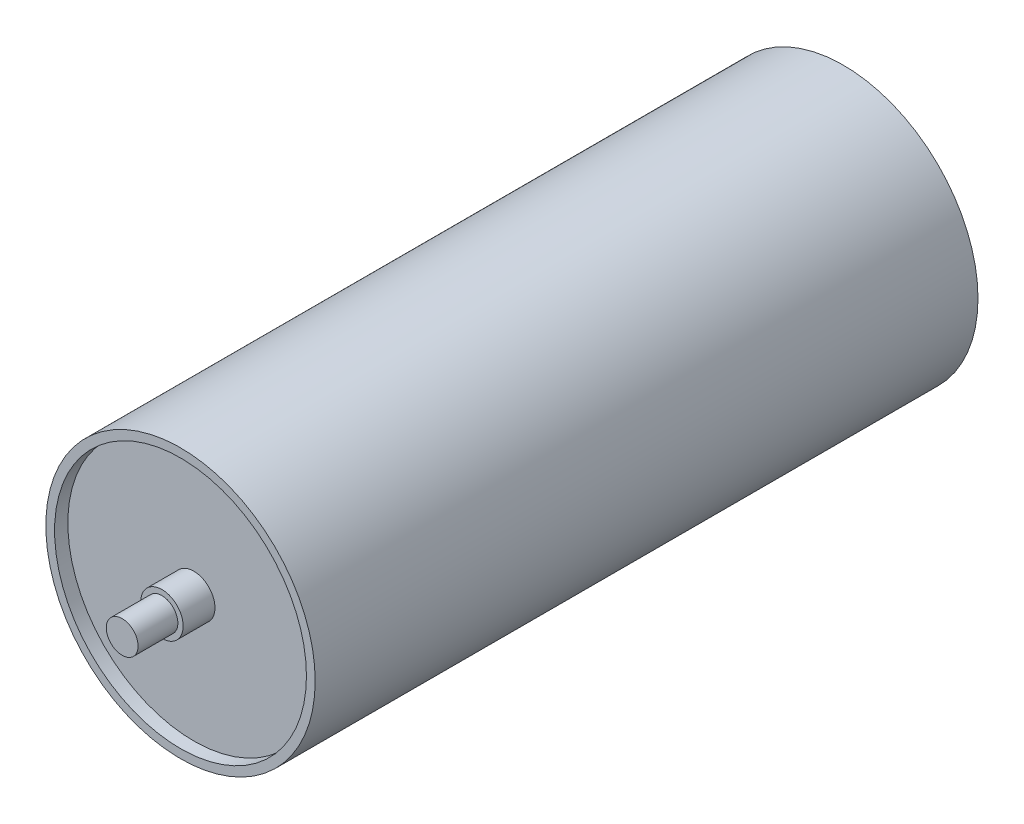
ISO-10303-21;
HEADER;
FILE_DESCRIPTION(('STEP AP214'),'2;1');
FILE_NAME('part.step','',(''),(''),'','','');
FILE_SCHEMA(('AUTOMOTIVE_DESIGN { 1 0 10303 214 1 1 1 1 }'));
ENDSEC;
DATA;
#1=APPLICATION_CONTEXT('core data for automotive mechanical design processes');
#2=APPLICATION_PROTOCOL_DEFINITION('international standard','automotive_design',2000,#1);
#3=PRODUCT_CONTEXT('',#1,'mechanical');
#4=PRODUCT('Part','Part','',(#3));
#5=PRODUCT_RELATED_PRODUCT_CATEGORY('part','',(#4));
#6=PRODUCT_DEFINITION_FORMATION('','',#4);
#7=PRODUCT_DEFINITION_CONTEXT('part definition',#1,'design');
#8=PRODUCT_DEFINITION('design','',#6,#7);
#9=PRODUCT_DEFINITION_SHAPE('','',#8);
#10=(LENGTH_UNIT() NAMED_UNIT(*) SI_UNIT(.MILLI.,.METRE.));
#11=(NAMED_UNIT(*) PLANE_ANGLE_UNIT() SI_UNIT($,.RADIAN.));
#12=(NAMED_UNIT(*) SI_UNIT($,.STERADIAN.) SOLID_ANGLE_UNIT());
#13=UNCERTAINTY_MEASURE_WITH_UNIT(LENGTH_MEASURE(1.E-05),#10,'distance_accuracy_value','');
#14=(GEOMETRIC_REPRESENTATION_CONTEXT(3) GLOBAL_UNCERTAINTY_ASSIGNED_CONTEXT((#13)) GLOBAL_UNIT_ASSIGNED_CONTEXT((#10,
#11,#12)) REPRESENTATION_CONTEXT('',''));
#15=CARTESIAN_POINT('',(0.,0.,0.));
#16=DIRECTION('',(0.,0.,1.));
#17=DIRECTION('',(1.,0.,0.));
#18=AXIS2_PLACEMENT_3D('',#15,#16,#17);
#19=CARTESIAN_POINT('',(0.,0.,250.));
#20=DIRECTION('',(0.,0.,-1.));
#21=DIRECTION('',(-1.,0.,0.));
#22=AXIS2_PLACEMENT_3D('',#19,#20,#21);
#23=CYLINDRICAL_SURFACE('',#22,50.8);
#24=CARTESIAN_POINT('',(0.,0.,250.));
#25=DIRECTION('',(0.,0.,1.));
#26=DIRECTION('',(1.,0.,0.));
#27=AXIS2_PLACEMENT_3D('',#24,#25,#26);
#28=CIRCLE('',#27,50.8);
#29=CARTESIAN_POINT('',(50.8,0.,250.));
#30=VERTEX_POINT('',#29);
#31=EDGE_CURVE('E50',#30,#30,#28,.T.);
#32=ORIENTED_EDGE('',*,*,#31,.F.);
#33=EDGE_LOOP('',(#32));
#34=FACE_BOUND('',#33,.T.);
#35=CARTESIAN_POINT('',(0.,0.,0.));
#36=DIRECTION('',(0.,0.,1.));
#37=DIRECTION('',(1.,0.,0.));
#38=AXIS2_PLACEMENT_3D('',#35,#36,#37);
#39=CIRCLE('',#38,50.8);
#40=CARTESIAN_POINT('',(50.8,0.,0.));
#41=VERTEX_POINT('',#40);
#42=EDGE_CURVE('E41',#41,#41,#39,.T.);
#43=ORIENTED_EDGE('',*,*,#42,.T.);
#44=EDGE_LOOP('',(#43));
#45=FACE_BOUND('',#44,.T.);
#46=ADVANCED_FACE('F38',(#34,#45),#23,.T.);
#47=CARTESIAN_POINT('',(0.,0.,250.));
#48=DIRECTION('',(0.,0.,1.));
#49=DIRECTION('',(1.,0.,0.));
#50=AXIS2_PLACEMENT_3D('',#47,#48,#49);
#51=PLANE('',#50);
#52=CARTESIAN_POINT('',(0.,0.,250.));
#53=DIRECTION('',(0.,0.,1.));
#54=DIRECTION('',(1.,0.,0.));
#55=AXIS2_PLACEMENT_3D('',#52,#53,#54);
#56=CIRCLE('',#55,47.5);
#57=CARTESIAN_POINT('',(47.5,0.,250.));
#58=VERTEX_POINT('',#57);
#59=EDGE_CURVE('E74',#58,#58,#56,.T.);
#60=ORIENTED_EDGE('',*,*,#59,.F.);
#61=EDGE_LOOP('',(#60));
#62=FACE_BOUND('',#61,.T.);
#63=ORIENTED_EDGE('',*,*,#31,.T.);
#64=EDGE_LOOP('',(#63));
#65=FACE_BOUND('',#64,.T.);
#66=ADVANCED_FACE('F91',(#62,#65),#51,.T.);
#67=CARTESIAN_POINT('',(0.,0.,0.));
#68=DIRECTION('',(0.,0.,1.));
#69=DIRECTION('',(1.,0.,0.));
#70=AXIS2_PLACEMENT_3D('',#67,#68,#69);
#71=PLANE('',#70);
#72=CARTESIAN_POINT('',(0.,0.,0.));
#73=DIRECTION('',(0.,0.,-1.));
#74=DIRECTION('',(-1.,0.,0.));
#75=AXIS2_PLACEMENT_3D('',#72,#73,#74);
#76=CIRCLE('',#75,47.5);
#77=CARTESIAN_POINT('',(-47.5,0.,0.));
#78=VERTEX_POINT('',#77);
#79=EDGE_CURVE('E68',#78,#78,#76,.T.);
#80=ORIENTED_EDGE('',*,*,#79,.F.);
#81=EDGE_LOOP('',(#80));
#82=FACE_BOUND('',#81,.T.);
#83=ORIENTED_EDGE('',*,*,#42,.F.);
#84=EDGE_LOOP('',(#83));
#85=FACE_BOUND('',#84,.T.);
#86=ADVANCED_FACE('F88',(#82,#85),#71,.F.);
#87=CARTESIAN_POINT('',(0.,0.,245.));
#88=DIRECTION('',(0.,0.,1.));
#89=DIRECTION('',(1.,0.,0.));
#90=AXIS2_PLACEMENT_3D('',#87,#88,#89);
#91=CYLINDRICAL_SURFACE('',#90,47.5);
#92=CARTESIAN_POINT('',(0.,0.,245.));
#93=DIRECTION('',(0.,0.,1.));
#94=DIRECTION('',(1.,0.,0.));
#95=AXIS2_PLACEMENT_3D('',#92,#93,#94);
#96=CIRCLE('',#95,47.5);
#97=CARTESIAN_POINT('',(47.5,0.,245.));
#98=VERTEX_POINT('',#97);
#99=EDGE_CURVE('E77',#98,#98,#96,.T.);
#100=ORIENTED_EDGE('',*,*,#99,.F.);
#101=EDGE_LOOP('',(#100));
#102=FACE_BOUND('',#101,.T.);
#103=ORIENTED_EDGE('',*,*,#59,.T.);
#104=EDGE_LOOP('',(#103));
#105=FACE_BOUND('',#104,.T.);
#106=ADVANCED_FACE('F90',(#102,#105),#91,.F.);
#107=CARTESIAN_POINT('',(0.,0.,245.));
#108=DIRECTION('',(0.,0.,1.));
#109=DIRECTION('',(1.,0.,0.));
#110=AXIS2_PLACEMENT_3D('',#107,#108,#109);
#111=PLANE('',#110);
#112=CARTESIAN_POINT('',(0.,0.,245.));
#113=DIRECTION('',(0.,0.,1.));
#114=DIRECTION('',(1.,0.,0.));
#115=AXIS2_PLACEMENT_3D('',#112,#113,#114);
#116=CIRCLE('',#115,8.);
#117=CARTESIAN_POINT('',(8.,0.,245.));
#118=VERTEX_POINT('',#117);
#119=EDGE_CURVE('E57',#118,#118,#116,.T.);
#120=ORIENTED_EDGE('',*,*,#119,.F.);
#121=EDGE_LOOP('',(#120));
#122=FACE_BOUND('',#121,.T.);
#123=ORIENTED_EDGE('',*,*,#99,.T.);
#124=EDGE_LOOP('',(#123));
#125=FACE_BOUND('',#124,.T.);
#126=ADVANCED_FACE('F97',(#122,#125),#111,.T.);
#127=CARTESIAN_POINT('',(0.,0.,5.));
#128=DIRECTION('',(0.,0.,-1.));
#129=DIRECTION('',(-1.,0.,0.));
#130=AXIS2_PLACEMENT_3D('',#127,#128,#129);
#131=CYLINDRICAL_SURFACE('',#130,47.5);
#132=CARTESIAN_POINT('',(0.,0.,5.));
#133=DIRECTION('',(0.,0.,-1.));
#134=DIRECTION('',(-1.,0.,0.));
#135=AXIS2_PLACEMENT_3D('',#132,#133,#134);
#136=CIRCLE('',#135,47.5);
#137=CARTESIAN_POINT('',(-47.5,0.,5.));
#138=VERTEX_POINT('',#137);
#139=EDGE_CURVE('E71',#138,#138,#136,.T.);
#140=ORIENTED_EDGE('',*,*,#139,.F.);
#141=EDGE_LOOP('',(#140));
#142=FACE_BOUND('',#141,.T.);
#143=ORIENTED_EDGE('',*,*,#79,.T.);
#144=EDGE_LOOP('',(#143));
#145=FACE_BOUND('',#144,.T.);
#146=ADVANCED_FACE('F131',(#142,#145),#131,.F.);
#147=CARTESIAN_POINT('',(0.,0.,5.));
#148=DIRECTION('',(0.,0.,-1.));
#149=DIRECTION('',(-1.,0.,0.));
#150=AXIS2_PLACEMENT_3D('',#147,#148,#149);
#151=PLANE('',#150);
#152=CARTESIAN_POINT('',(0.,0.,5.));
#153=DIRECTION('',(0.,0.,-1.));
#154=DIRECTION('',(-1.,0.,0.));
#155=AXIS2_PLACEMENT_3D('',#152,#153,#154);
#156=CIRCLE('',#155,8.);
#157=CARTESIAN_POINT('',(-8.,0.,5.));
#158=VERTEX_POINT('',#157);
#159=EDGE_CURVE('E62',#158,#158,#156,.T.);
#160=ORIENTED_EDGE('',*,*,#159,.F.);
#161=EDGE_LOOP('',(#160));
#162=FACE_BOUND('',#161,.T.);
#163=ORIENTED_EDGE('',*,*,#139,.T.);
#164=EDGE_LOOP('',(#163));
#165=FACE_BOUND('',#164,.T.);
#166=ADVANCED_FACE('F136',(#162,#165),#151,.T.);
#167=CARTESIAN_POINT('',(0.,0.,-6.));
#168=DIRECTION('',(0.,0.,1.));
#169=DIRECTION('',(1.,0.,0.));
#170=AXIS2_PLACEMENT_3D('',#167,#168,#169);
#171=CYLINDRICAL_SURFACE('',#170,8.);
#172=CARTESIAN_POINT('',(0.,0.,-6.));
#173=DIRECTION('',(0.,0.,-1.));
#174=DIRECTION('',(-1.,0.,0.));
#175=AXIS2_PLACEMENT_3D('',#172,#173,#174);
#176=CIRCLE('',#175,8.);
#177=CARTESIAN_POINT('',(-8.,0.,-6.));
#178=VERTEX_POINT('',#177);
#179=EDGE_CURVE('E65',#178,#178,#176,.T.);
#180=ORIENTED_EDGE('',*,*,#179,.F.);
#181=EDGE_LOOP('',(#180));
#182=FACE_BOUND('',#181,.T.);
#183=ORIENTED_EDGE('',*,*,#159,.T.);
#184=EDGE_LOOP('',(#183));
#185=FACE_BOUND('',#184,.T.);
#186=ADVANCED_FACE('F147',(#182,#185),#171,.T.);
#187=CARTESIAN_POINT('',(0.,0.,-6.));
#188=DIRECTION('',(0.,0.,-1.));
#189=DIRECTION('',(-1.,0.,0.));
#190=AXIS2_PLACEMENT_3D('',#187,#188,#189);
#191=PLANE('',#190);
#192=CARTESIAN_POINT('',(0.,0.,-6.));
#193=DIRECTION('',(0.,0.,-1.));
#194=DIRECTION('',(-1.,0.,0.));
#195=AXIS2_PLACEMENT_3D('',#192,#193,#194);
#196=CIRCLE('',#195,6.);
#197=CARTESIAN_POINT('',(-6.,0.,-6.));
#198=VERTEX_POINT('',#197);
#199=EDGE_CURVE('E45',#198,#198,#196,.T.);
#200=ORIENTED_EDGE('',*,*,#199,.F.);
#201=EDGE_LOOP('',(#200));
#202=FACE_BOUND('',#201,.T.);
#203=ORIENTED_EDGE('',*,*,#179,.T.);
#204=EDGE_LOOP('',(#203));
#205=FACE_BOUND('',#204,.T.);
#206=ADVANCED_FACE('F158',(#202,#205),#191,.T.);
#207=CARTESIAN_POINT('',(0.,0.,257.));
#208=DIRECTION('',(0.,0.,-1.));
#209=DIRECTION('',(-1.,0.,0.));
#210=AXIS2_PLACEMENT_3D('',#207,#208,#209);
#211=CYLINDRICAL_SURFACE('',#210,8.);
#212=CARTESIAN_POINT('',(0.,0.,257.));
#213=DIRECTION('',(0.,0.,1.));
#214=DIRECTION('',(1.,0.,0.));
#215=AXIS2_PLACEMENT_3D('',#212,#213,#214);
#216=CIRCLE('',#215,8.);
#217=CARTESIAN_POINT('',(8.,0.,257.));
#218=VERTEX_POINT('',#217);
#219=EDGE_CURVE('E59',#218,#218,#216,.T.);
#220=ORIENTED_EDGE('',*,*,#219,.F.);
#221=EDGE_LOOP('',(#220));
#222=FACE_BOUND('',#221,.T.);
#223=ORIENTED_EDGE('',*,*,#119,.T.);
#224=EDGE_LOOP('',(#223));
#225=FACE_BOUND('',#224,.T.);
#226=ADVANCED_FACE('F175',(#222,#225),#211,.T.);
#227=CARTESIAN_POINT('',(0.,0.,257.));
#228=DIRECTION('',(0.,0.,1.));
#229=DIRECTION('',(1.,0.,0.));
#230=AXIS2_PLACEMENT_3D('',#227,#228,#229);
#231=PLANE('',#230);
#232=CARTESIAN_POINT('',(0.,0.,257.));
#233=DIRECTION('',(0.,0.,1.));
#234=DIRECTION('',(1.,0.,0.));
#235=AXIS2_PLACEMENT_3D('',#232,#233,#234);
#236=CIRCLE('',#235,6.);
#237=CARTESIAN_POINT('',(6.,0.,257.));
#238=VERTEX_POINT('',#237);
#239=EDGE_CURVE('E10',#238,#238,#236,.T.);
#240=ORIENTED_EDGE('',*,*,#239,.F.);
#241=EDGE_LOOP('',(#240));
#242=FACE_BOUND('',#241,.T.);
#243=ORIENTED_EDGE('',*,*,#219,.T.);
#244=EDGE_LOOP('',(#243));
#245=FACE_BOUND('',#244,.T.);
#246=ADVANCED_FACE('F180',(#242,#245),#231,.T.);
#247=CARTESIAN_POINT('',(0.,0.,-16.));
#248=DIRECTION('',(0.,0.,1.));
#249=DIRECTION('',(1.,0.,0.));
#250=AXIS2_PLACEMENT_3D('',#247,#248,#249);
#251=CYLINDRICAL_SURFACE('',#250,6.);
#252=CARTESIAN_POINT('',(0.,0.,-16.));
#253=DIRECTION('',(0.,0.,-1.));
#254=DIRECTION('',(-1.,0.,0.));
#255=AXIS2_PLACEMENT_3D('',#252,#253,#254);
#256=CIRCLE('',#255,6.);
#257=CARTESIAN_POINT('',(-6.,0.,-16.));
#258=VERTEX_POINT('',#257);
#259=EDGE_CURVE('E55',#258,#258,#256,.T.);
#260=ORIENTED_EDGE('',*,*,#259,.F.);
#261=EDGE_LOOP('',(#260));
#262=FACE_BOUND('',#261,.T.);
#263=ORIENTED_EDGE('',*,*,#199,.T.);
#264=EDGE_LOOP('',(#263));
#265=FACE_BOUND('',#264,.T.);
#266=ADVANCED_FACE('F197',(#262,#265),#251,.T.);
#267=CARTESIAN_POINT('',(0.,0.,-16.));
#268=DIRECTION('',(0.,0.,-1.));
#269=DIRECTION('',(-1.,0.,0.));
#270=AXIS2_PLACEMENT_3D('',#267,#268,#269);
#271=PLANE('',#270);
#272=ORIENTED_EDGE('',*,*,#259,.T.);
#273=EDGE_LOOP('',(#272));
#274=FACE_BOUND('',#273,.T.);
#275=ADVANCED_FACE('F202',(#274),#271,.T.);
#276=CARTESIAN_POINT('',(0.,0.,272.));
#277=DIRECTION('',(0.,0.,-1.));
#278=DIRECTION('',(-1.,0.,0.));
#279=AXIS2_PLACEMENT_3D('',#276,#277,#278);
#280=CYLINDRICAL_SURFACE('',#279,6.);
#281=CARTESIAN_POINT('',(0.,0.,272.));
#282=DIRECTION('',(0.,0.,1.));
#283=DIRECTION('',(1.,0.,0.));
#284=AXIS2_PLACEMENT_3D('',#281,#282,#283);
#285=CIRCLE('',#284,6.);
#286=CARTESIAN_POINT('',(6.,0.,272.));
#287=VERTEX_POINT('',#286);
#288=EDGE_CURVE('E54',#287,#287,#285,.T.);
#289=ORIENTED_EDGE('',*,*,#288,.F.);
#290=EDGE_LOOP('',(#289));
#291=FACE_BOUND('',#290,.T.);
#292=ORIENTED_EDGE('',*,*,#239,.T.);
#293=EDGE_LOOP('',(#292));
#294=FACE_BOUND('',#293,.T.);
#295=ADVANCED_FACE('F213',(#291,#294),#280,.T.);
#296=CARTESIAN_POINT('',(0.,0.,272.));
#297=DIRECTION('',(0.,0.,1.));
#298=DIRECTION('',(1.,0.,0.));
#299=AXIS2_PLACEMENT_3D('',#296,#297,#298);
#300=PLANE('',#299);
#301=ORIENTED_EDGE('',*,*,#288,.T.);
#302=EDGE_LOOP('',(#301));
#303=FACE_BOUND('',#302,.T.);
#304=ADVANCED_FACE('F232',(#303),#300,.T.);
#305=CLOSED_SHELL('',(#46,#66,#86,#106,#126,#146,#166,#186,#206,#226,#246,#266,#275,#295,#304));
#306=MANIFOLD_SOLID_BREP('B2',#305);
#307=ADVANCED_BREP_SHAPE_REPRESENTATION('',(#18,#306),#14);
#308=SHAPE_DEFINITION_REPRESENTATION(#9,#307);
ENDSEC;
END-ISO-10303-21;
